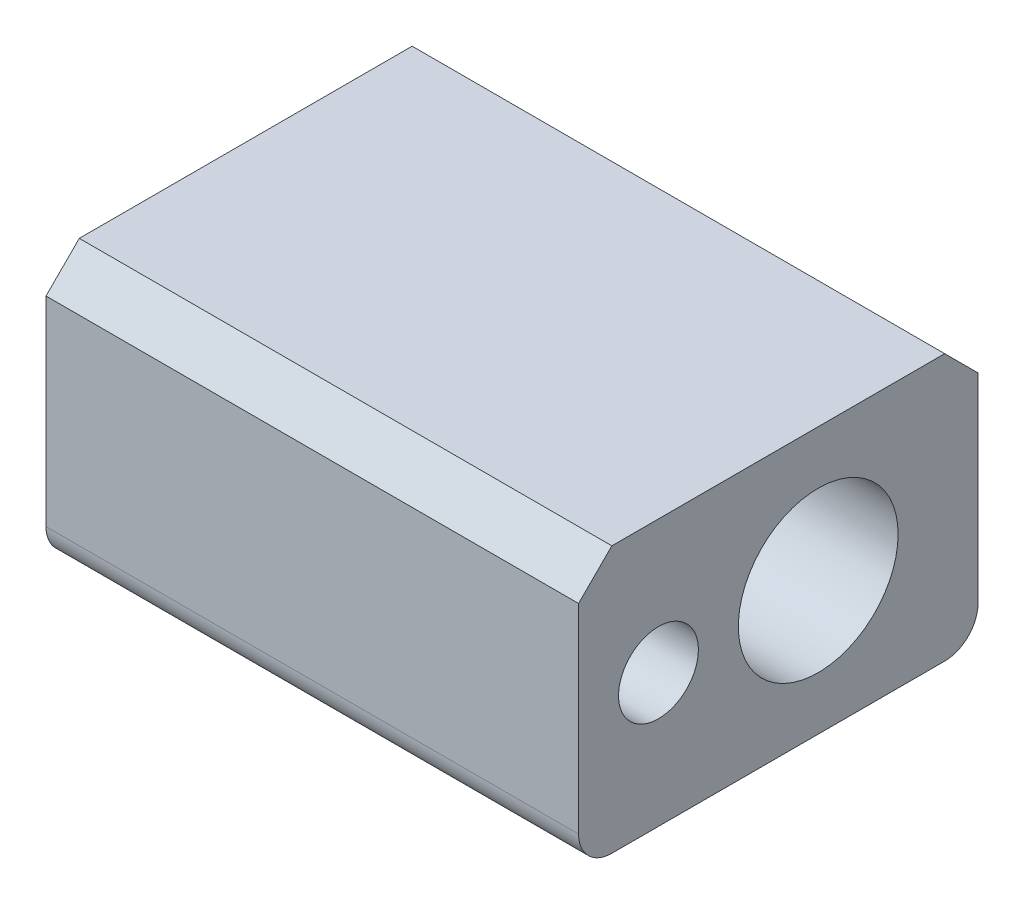
ISO-10303-21;
HEADER;
FILE_DESCRIPTION(('STEP AP214'),'2;1');
FILE_NAME('part.step','',(''),(''),'','','');
FILE_SCHEMA(('AUTOMOTIVE_DESIGN { 1 0 10303 214 1 1 1 1 }'));
ENDSEC;
DATA;
#1=APPLICATION_CONTEXT('core data for automotive mechanical design processes');
#2=APPLICATION_PROTOCOL_DEFINITION('international standard','automotive_design',2000,#1);
#3=PRODUCT_CONTEXT('',#1,'mechanical');
#4=PRODUCT('Part','Part','',(#3));
#5=PRODUCT_RELATED_PRODUCT_CATEGORY('part','',(#4));
#6=PRODUCT_DEFINITION_FORMATION('','',#4);
#7=PRODUCT_DEFINITION_CONTEXT('part definition',#1,'design');
#8=PRODUCT_DEFINITION('design','',#6,#7);
#9=PRODUCT_DEFINITION_SHAPE('','',#8);
#10=(LENGTH_UNIT() NAMED_UNIT(*) SI_UNIT(.MILLI.,.METRE.));
#11=(NAMED_UNIT(*) PLANE_ANGLE_UNIT() SI_UNIT($,.RADIAN.));
#12=(NAMED_UNIT(*) SI_UNIT($,.STERADIAN.) SOLID_ANGLE_UNIT());
#13=UNCERTAINTY_MEASURE_WITH_UNIT(LENGTH_MEASURE(1.E-05),#10,'distance_accuracy_value','');
#14=(GEOMETRIC_REPRESENTATION_CONTEXT(3) GLOBAL_UNCERTAINTY_ASSIGNED_CONTEXT((#13)) GLOBAL_UNIT_ASSIGNED_CONTEXT((#10,
#11,#12)) REPRESENTATION_CONTEXT('',''));
#15=CARTESIAN_POINT('',(0.,0.,0.));
#16=DIRECTION('',(0.,0.,1.));
#17=DIRECTION('',(1.,0.,0.));
#18=AXIS2_PLACEMENT_3D('',#15,#16,#17);
#19=CARTESIAN_POINT('',(101.6,0.,0.));
#20=DIRECTION('',(1.,0.,0.));
#21=DIRECTION('',(0.,0.,-1.));
#22=AXIS2_PLACEMENT_3D('',#19,#20,#21);
#23=PLANE('',#22);
#24=CARTESIAN_POINT('',(101.6,0.,-7.62000000000001));
#25=DIRECTION('',(1.,0.,0.));
#26=DIRECTION('',(0.,0.,-1.));
#27=AXIS2_PLACEMENT_3D('',#24,#25,#26);
#28=CIRCLE('',#27,15.24);
#29=CARTESIAN_POINT('',(101.6,0.,-22.86));
#30=VERTEX_POINT('',#29);
#31=EDGE_CURVE('E150',#30,#30,#28,.T.);
#32=ORIENTED_EDGE('',*,*,#31,.F.);
#33=EDGE_LOOP('',(#32));
#34=FACE_BOUND('',#33,.T.);
#35=DIRECTION('',(0.,1.,0.));
#36=VECTOR('',#35,1.);
#37=CARTESIAN_POINT('',(101.6,25.4,-38.1));
#38=LINE('',#37,#36);
#39=CARTESIAN_POINT('',(101.6,-19.05,-38.1));
#40=VERTEX_POINT('',#39);
#41=CARTESIAN_POINT('',(101.6,19.05,-38.1));
#42=VERTEX_POINT('',#41);
#43=EDGE_CURVE('E133',#40,#42,#38,.T.);
#44=ORIENTED_EDGE('',*,*,#43,.T.);
#45=DIRECTION('',(0.,-0.70710678118655,-0.707106781186545));
#46=VECTOR('',#45,1.);
#47=CARTESIAN_POINT('',(101.6,28.5749999999999,-28.5750000000001));
#48=LINE('',#47,#46);
#49=CARTESIAN_POINT('',(101.6,25.4,-31.75));
#50=VERTEX_POINT('',#49);
#51=EDGE_CURVE('E57',#42,#50,#48,.F.);
#52=ORIENTED_EDGE('',*,*,#51,.T.);
#53=DIRECTION('',(0.,0.,1.));
#54=VECTOR('',#53,1.);
#55=CARTESIAN_POINT('',(101.6,25.4,-38.1));
#56=LINE('',#55,#54);
#57=CARTESIAN_POINT('',(101.6,25.4,31.75));
#58=VERTEX_POINT('',#57);
#59=EDGE_CURVE('E194',#50,#58,#56,.T.);
#60=ORIENTED_EDGE('',*,*,#59,.T.);
#61=DIRECTION('',(0.,0.707106781186546,-0.707106781186549));
#62=VECTOR('',#61,1.);
#63=CARTESIAN_POINT('',(101.6,28.5750000000001,28.5749999999999));
#64=LINE('',#63,#62);
#65=CARTESIAN_POINT('',(101.6,19.05,38.1));
#66=VERTEX_POINT('',#65);
#67=EDGE_CURVE('E64',#58,#66,#64,.F.);
#68=ORIENTED_EDGE('',*,*,#67,.T.);
#69=DIRECTION('',(0.,-1.,0.));
#70=VECTOR('',#69,1.);
#71=CARTESIAN_POINT('',(101.6,25.4,38.1));
#72=LINE('',#71,#70);
#73=CARTESIAN_POINT('',(101.6,-19.05,38.1));
#74=VERTEX_POINT('',#73);
#75=EDGE_CURVE('E135',#66,#74,#72,.T.);
#76=ORIENTED_EDGE('',*,*,#75,.T.);
#77=CARTESIAN_POINT('',(101.6,-19.05,31.75));
#78=DIRECTION('',(1.,0.,0.));
#79=DIRECTION('',(0.,0.,-1.));
#80=AXIS2_PLACEMENT_3D('',#77,#78,#79);
#81=CIRCLE('',#80,6.35);
#82=CARTESIAN_POINT('',(101.6,-25.4,31.75));
#83=VERTEX_POINT('',#82);
#84=EDGE_CURVE('E165',#74,#83,#81,.T.);
#85=ORIENTED_EDGE('',*,*,#84,.T.);
#86=DIRECTION('',(0.,0.,-1.));
#87=VECTOR('',#86,1.);
#88=CARTESIAN_POINT('',(101.6,-25.4,-38.1));
#89=LINE('',#88,#87);
#90=CARTESIAN_POINT('',(101.6,-25.4,-31.75));
#91=VERTEX_POINT('',#90);
#92=EDGE_CURVE('E155',#83,#91,#89,.T.);
#93=ORIENTED_EDGE('',*,*,#92,.T.);
#94=CARTESIAN_POINT('',(101.6,-19.05,-31.75));
#95=DIRECTION('',(1.,0.,0.));
#96=DIRECTION('',(0.,0.,-1.));
#97=AXIS2_PLACEMENT_3D('',#94,#95,#96);
#98=CIRCLE('',#97,6.35);
#99=EDGE_CURVE('E168',#91,#40,#98,.T.);
#100=ORIENTED_EDGE('',*,*,#99,.T.);
#101=EDGE_LOOP('',(#44,#52,#60,#68,#76,#85,#93,#100));
#102=FACE_BOUND('',#101,.T.);
#103=CARTESIAN_POINT('',(101.6,0.,22.86));
#104=DIRECTION('',(1.,0.,0.));
#105=DIRECTION('',(0.,0.,-1.));
#106=AXIS2_PLACEMENT_3D('',#103,#104,#105);
#107=CIRCLE('',#106,7.62);
#108=CARTESIAN_POINT('',(101.6,0.,15.24));
#109=VERTEX_POINT('',#108);
#110=EDGE_CURVE('E250',#109,#109,#107,.T.);
#111=ORIENTED_EDGE('',*,*,#110,.F.);
#112=EDGE_LOOP('',(#111));
#113=FACE_BOUND('',#112,.T.);
#114=ADVANCED_FACE('F47',(#34,#102,#113),#23,.T.);
#115=CARTESIAN_POINT('',(0.,0.,0.));
#116=DIRECTION('',(1.,0.,0.));
#117=DIRECTION('',(0.,0.,-1.));
#118=AXIS2_PLACEMENT_3D('',#115,#116,#117);
#119=PLANE('',#118);
#120=DIRECTION('',(0.,0.,1.));
#121=VECTOR('',#120,1.);
#122=CARTESIAN_POINT('',(0.,25.4,-38.1));
#123=LINE('',#122,#121);
#124=CARTESIAN_POINT('',(0.,25.4,-31.75));
#125=VERTEX_POINT('',#124);
#126=CARTESIAN_POINT('',(0.,25.4,31.75));
#127=VERTEX_POINT('',#126);
#128=EDGE_CURVE('E142',#125,#127,#123,.T.);
#129=ORIENTED_EDGE('',*,*,#128,.F.);
#130=DIRECTION('',(0.,0.70710678118655,0.707106781186545));
#131=VECTOR('',#130,1.);
#132=CARTESIAN_POINT('',(0.,25.4,-31.75));
#133=LINE('',#132,#131);
#134=CARTESIAN_POINT('',(0.,19.05,-38.1));
#135=VERTEX_POINT('',#134);
#136=EDGE_CURVE('E140',#125,#135,#133,.F.);
#137=ORIENTED_EDGE('',*,*,#136,.T.);
#138=DIRECTION('',(0.,1.,0.));
#139=VECTOR('',#138,1.);
#140=CARTESIAN_POINT('',(0.,25.4,-38.1));
#141=LINE('',#140,#139);
#142=CARTESIAN_POINT('',(0.,-19.05,-38.1));
#143=VERTEX_POINT('',#142);
#144=EDGE_CURVE('E132',#143,#135,#141,.T.);
#145=ORIENTED_EDGE('',*,*,#144,.F.);
#146=CARTESIAN_POINT('',(0.,-19.05,-31.75));
#147=DIRECTION('',(1.,0.,0.));
#148=DIRECTION('',(0.,0.,-1.));
#149=AXIS2_PLACEMENT_3D('',#146,#147,#148);
#150=CIRCLE('',#149,6.35);
#151=CARTESIAN_POINT('',(0.,-25.4,-31.75));
#152=VERTEX_POINT('',#151);
#153=EDGE_CURVE('E117',#143,#152,#150,.F.);
#154=ORIENTED_EDGE('',*,*,#153,.T.);
#155=DIRECTION('',(0.,0.,-1.));
#156=VECTOR('',#155,1.);
#157=CARTESIAN_POINT('',(0.,-25.4,-38.1));
#158=LINE('',#157,#156);
#159=CARTESIAN_POINT('',(0.,-25.4,31.75));
#160=VERTEX_POINT('',#159);
#161=EDGE_CURVE('E143',#160,#152,#158,.T.);
#162=ORIENTED_EDGE('',*,*,#161,.F.);
#163=CARTESIAN_POINT('',(0.,-19.05,31.75));
#164=DIRECTION('',(1.,0.,0.));
#165=DIRECTION('',(0.,0.,-1.));
#166=AXIS2_PLACEMENT_3D('',#163,#164,#165);
#167=CIRCLE('',#166,6.35);
#168=CARTESIAN_POINT('',(0.,-19.05,38.1));
#169=VERTEX_POINT('',#168);
#170=EDGE_CURVE('E129',#160,#169,#167,.F.);
#171=ORIENTED_EDGE('',*,*,#170,.T.);
#172=DIRECTION('',(0.,-1.,0.));
#173=VECTOR('',#172,1.);
#174=CARTESIAN_POINT('',(0.,25.4,38.1));
#175=LINE('',#174,#173);
#176=CARTESIAN_POINT('',(0.,19.05,38.1));
#177=VERTEX_POINT('',#176);
#178=EDGE_CURVE('E148',#177,#169,#175,.T.);
#179=ORIENTED_EDGE('',*,*,#178,.F.);
#180=DIRECTION('',(0.,-0.707106781186546,0.707106781186549));
#181=VECTOR('',#180,1.);
#182=CARTESIAN_POINT('',(0.,19.05,38.1));
#183=LINE('',#182,#181);
#184=EDGE_CURVE('E182',#177,#127,#183,.F.);
#185=ORIENTED_EDGE('',*,*,#184,.T.);
#186=EDGE_LOOP('',(#129,#137,#145,#154,#162,#171,#179,#185));
#187=FACE_BOUND('',#186,.T.);
#188=CARTESIAN_POINT('',(0.,0.,-7.62000000000001));
#189=DIRECTION('',(1.,0.,0.));
#190=DIRECTION('',(0.,0.,-1.));
#191=AXIS2_PLACEMENT_3D('',#188,#189,#190);
#192=CIRCLE('',#191,15.24);
#193=CARTESIAN_POINT('',(0.,0.,-22.86));
#194=VERTEX_POINT('',#193);
#195=EDGE_CURVE('E258',#194,#194,#192,.T.);
#196=ORIENTED_EDGE('',*,*,#195,.T.);
#197=EDGE_LOOP('',(#196));
#198=FACE_BOUND('',#197,.T.);
#199=CARTESIAN_POINT('',(0.,0.,22.86));
#200=DIRECTION('',(1.,0.,0.));
#201=DIRECTION('',(0.,0.,-1.));
#202=AXIS2_PLACEMENT_3D('',#199,#200,#201);
#203=CIRCLE('',#202,7.62);
#204=CARTESIAN_POINT('',(0.,0.,15.24));
#205=VERTEX_POINT('',#204);
#206=EDGE_CURVE('E253',#205,#205,#203,.T.);
#207=ORIENTED_EDGE('',*,*,#206,.T.);
#208=EDGE_LOOP('',(#207));
#209=FACE_BOUND('',#208,.T.);
#210=ADVANCED_FACE('F138',(#187,#198,#209),#119,.F.);
#211=CARTESIAN_POINT('',(101.6,-25.4,-38.1));
#212=DIRECTION('',(0.,1.,0.));
#213=DIRECTION('',(0.,0.,1.));
#214=AXIS2_PLACEMENT_3D('',#211,#212,#213);
#215=PLANE('',#214);
#216=ORIENTED_EDGE('',*,*,#161,.T.);
#217=DIRECTION('',(-1.,0.,0.));
#218=VECTOR('',#217,1.);
#219=CARTESIAN_POINT('',(101.6,-25.4,-31.75));
#220=LINE('',#219,#218);
#221=EDGE_CURVE('E122',#152,#91,#220,.F.);
#222=ORIENTED_EDGE('',*,*,#221,.T.);
#223=ORIENTED_EDGE('',*,*,#92,.F.);
#224=DIRECTION('',(-1.,0.,0.));
#225=VECTOR('',#224,1.);
#226=CARTESIAN_POINT('',(101.6,-25.4,31.75));
#227=LINE('',#226,#225);
#228=EDGE_CURVE('E128',#83,#160,#227,.T.);
#229=ORIENTED_EDGE('',*,*,#228,.T.);
#230=EDGE_LOOP('',(#216,#222,#223,#229));
#231=FACE_BOUND('',#230,.T.);
#232=ADVANCED_FACE('F220',(#231),#215,.F.);
#233=CARTESIAN_POINT('',(101.6,25.4,-38.1));
#234=DIRECTION('',(0.,0.,1.));
#235=DIRECTION('',(0.,-1.,0.));
#236=AXIS2_PLACEMENT_3D('',#233,#234,#235);
#237=PLANE('',#236);
#238=ORIENTED_EDGE('',*,*,#144,.T.);
#239=DIRECTION('',(1.,0.,0.));
#240=VECTOR('',#239,1.);
#241=CARTESIAN_POINT('',(101.6,19.05,-38.1));
#242=LINE('',#241,#240);
#243=EDGE_CURVE('E72',#135,#42,#242,.T.);
#244=ORIENTED_EDGE('',*,*,#243,.T.);
#245=ORIENTED_EDGE('',*,*,#43,.F.);
#246=DIRECTION('',(-1.,0.,0.));
#247=VECTOR('',#246,1.);
#248=CARTESIAN_POINT('',(101.6,-19.05,-38.1));
#249=LINE('',#248,#247);
#250=EDGE_CURVE('E121',#40,#143,#249,.T.);
#251=ORIENTED_EDGE('',*,*,#250,.T.);
#252=EDGE_LOOP('',(#238,#244,#245,#251));
#253=FACE_BOUND('',#252,.T.);
#254=ADVANCED_FACE('F131',(#253),#237,.F.);
#255=CARTESIAN_POINT('',(101.6,25.4,-38.1));
#256=DIRECTION('',(0.,-1.,0.));
#257=DIRECTION('',(0.,0.,-1.));
#258=AXIS2_PLACEMENT_3D('',#255,#256,#257);
#259=PLANE('',#258);
#260=ORIENTED_EDGE('',*,*,#59,.F.);
#261=DIRECTION('',(-1.,0.,0.));
#262=VECTOR('',#261,1.);
#263=CARTESIAN_POINT('',(101.6,25.4,-31.75));
#264=LINE('',#263,#262);
#265=EDGE_CURVE('E178',#50,#125,#264,.T.);
#266=ORIENTED_EDGE('',*,*,#265,.T.);
#267=ORIENTED_EDGE('',*,*,#128,.T.);
#268=DIRECTION('',(1.,0.,0.));
#269=VECTOR('',#268,1.);
#270=CARTESIAN_POINT('',(101.6,25.4,31.75));
#271=LINE('',#270,#269);
#272=EDGE_CURVE('E175',#127,#58,#271,.T.);
#273=ORIENTED_EDGE('',*,*,#272,.T.);
#274=EDGE_LOOP('',(#260,#266,#267,#273));
#275=FACE_BOUND('',#274,.T.);
#276=ADVANCED_FACE('F198',(#275),#259,.F.);
#277=CARTESIAN_POINT('',(101.6,25.4,38.1));
#278=DIRECTION('',(0.,0.,-1.));
#279=DIRECTION('',(-1.,0.,0.));
#280=AXIS2_PLACEMENT_3D('',#277,#278,#279);
#281=PLANE('',#280);
#282=ORIENTED_EDGE('',*,*,#75,.F.);
#283=DIRECTION('',(-1.,0.,0.));
#284=VECTOR('',#283,1.);
#285=CARTESIAN_POINT('',(101.6,19.05,38.1));
#286=LINE('',#285,#284);
#287=EDGE_CURVE('E11',#66,#177,#286,.T.);
#288=ORIENTED_EDGE('',*,*,#287,.T.);
#289=ORIENTED_EDGE('',*,*,#178,.T.);
#290=DIRECTION('',(-1.,0.,0.));
#291=VECTOR('',#290,1.);
#292=CARTESIAN_POINT('',(101.6,-19.05,38.1));
#293=LINE('',#292,#291);
#294=EDGE_CURVE('E171',#169,#74,#293,.F.);
#295=ORIENTED_EDGE('',*,*,#294,.T.);
#296=EDGE_LOOP('',(#282,#288,#289,#295));
#297=FACE_BOUND('',#296,.T.);
#298=ADVANCED_FACE('F227',(#297),#281,.F.);
#299=CARTESIAN_POINT('',(101.6,0.,-7.62000000000001));
#300=DIRECTION('',(-1.,0.,0.));
#301=DIRECTION('',(0.,0.,1.));
#302=AXIS2_PLACEMENT_3D('',#299,#300,#301);
#303=CYLINDRICAL_SURFACE('',#302,15.24);
#304=ORIENTED_EDGE('',*,*,#31,.T.);
#305=EDGE_LOOP('',(#304));
#306=FACE_BOUND('',#305,.T.);
#307=ORIENTED_EDGE('',*,*,#195,.F.);
#308=EDGE_LOOP('',(#307));
#309=FACE_BOUND('',#308,.T.);
#310=ADVANCED_FACE('F224',(#306,#309),#303,.F.);
#311=CARTESIAN_POINT('',(101.6,0.,22.86));
#312=DIRECTION('',(-1.,0.,0.));
#313=DIRECTION('',(0.,0.,1.));
#314=AXIS2_PLACEMENT_3D('',#311,#312,#313);
#315=CYLINDRICAL_SURFACE('',#314,7.62);
#316=ORIENTED_EDGE('',*,*,#110,.T.);
#317=EDGE_LOOP('',(#316));
#318=FACE_BOUND('',#317,.T.);
#319=ORIENTED_EDGE('',*,*,#206,.F.);
#320=EDGE_LOOP('',(#319));
#321=FACE_BOUND('',#320,.T.);
#322=ADVANCED_FACE('F238',(#318,#321),#315,.F.);
#323=CARTESIAN_POINT('',(101.6,-19.05,-31.75));
#324=DIRECTION('',(-1.,0.,0.));
#325=DIRECTION('',(0.,0.,1.));
#326=AXIS2_PLACEMENT_3D('',#323,#324,#325);
#327=CYLINDRICAL_SURFACE('',#326,6.35);
#328=ORIENTED_EDGE('',*,*,#99,.F.);
#329=ORIENTED_EDGE('',*,*,#221,.F.);
#330=ORIENTED_EDGE('',*,*,#153,.F.);
#331=ORIENTED_EDGE('',*,*,#250,.F.);
#332=EDGE_LOOP('',(#328,#329,#330,#331));
#333=FACE_BOUND('',#332,.T.);
#334=ADVANCED_FACE('F120',(#333),#327,.T.);
#335=CARTESIAN_POINT('',(101.6,-19.05,31.75));
#336=DIRECTION('',(-1.,0.,0.));
#337=DIRECTION('',(0.,0.,1.));
#338=AXIS2_PLACEMENT_3D('',#335,#336,#337);
#339=CYLINDRICAL_SURFACE('',#338,6.35);
#340=ORIENTED_EDGE('',*,*,#84,.F.);
#341=ORIENTED_EDGE('',*,*,#294,.F.);
#342=ORIENTED_EDGE('',*,*,#170,.F.);
#343=ORIENTED_EDGE('',*,*,#228,.F.);
#344=EDGE_LOOP('',(#340,#341,#342,#343));
#345=FACE_BOUND('',#344,.T.);
#346=ADVANCED_FACE('F204',(#345),#339,.T.);
#347=CARTESIAN_POINT('',(101.6,25.4,-31.75));
#348=DIRECTION('',(0.,-0.707106781186545,0.70710678118655));
#349=DIRECTION('',(-1.,0.,0.));
#350=AXIS2_PLACEMENT_3D('',#347,#348,#349);
#351=PLANE('',#350);
#352=ORIENTED_EDGE('',*,*,#51,.F.);
#353=ORIENTED_EDGE('',*,*,#243,.F.);
#354=ORIENTED_EDGE('',*,*,#136,.F.);
#355=ORIENTED_EDGE('',*,*,#265,.F.);
#356=EDGE_LOOP('',(#352,#353,#354,#355));
#357=FACE_BOUND('',#356,.T.);
#358=ADVANCED_FACE('F202',(#357),#351,.F.);
#359=CARTESIAN_POINT('',(101.6,19.05,38.1));
#360=DIRECTION('',(0.,-0.707106781186549,-0.707106781186546));
#361=DIRECTION('',(-1.,0.,0.));
#362=AXIS2_PLACEMENT_3D('',#359,#360,#361);
#363=PLANE('',#362);
#364=ORIENTED_EDGE('',*,*,#67,.F.);
#365=ORIENTED_EDGE('',*,*,#272,.F.);
#366=ORIENTED_EDGE('',*,*,#184,.F.);
#367=ORIENTED_EDGE('',*,*,#287,.F.);
#368=EDGE_LOOP('',(#364,#365,#366,#367));
#369=FACE_BOUND('',#368,.T.);
#370=ADVANCED_FACE('F50',(#369),#363,.F.);
#371=CLOSED_SHELL('',(#114,#210,#232,#254,#276,#298,#310,#322,#334,#346,#358,#370));
#372=MANIFOLD_SOLID_BREP('B2',#371);
#373=ADVANCED_BREP_SHAPE_REPRESENTATION('',(#18,#372),#14);
#374=SHAPE_DEFINITION_REPRESENTATION(#9,#373);
ENDSEC;
END-ISO-10303-21;
